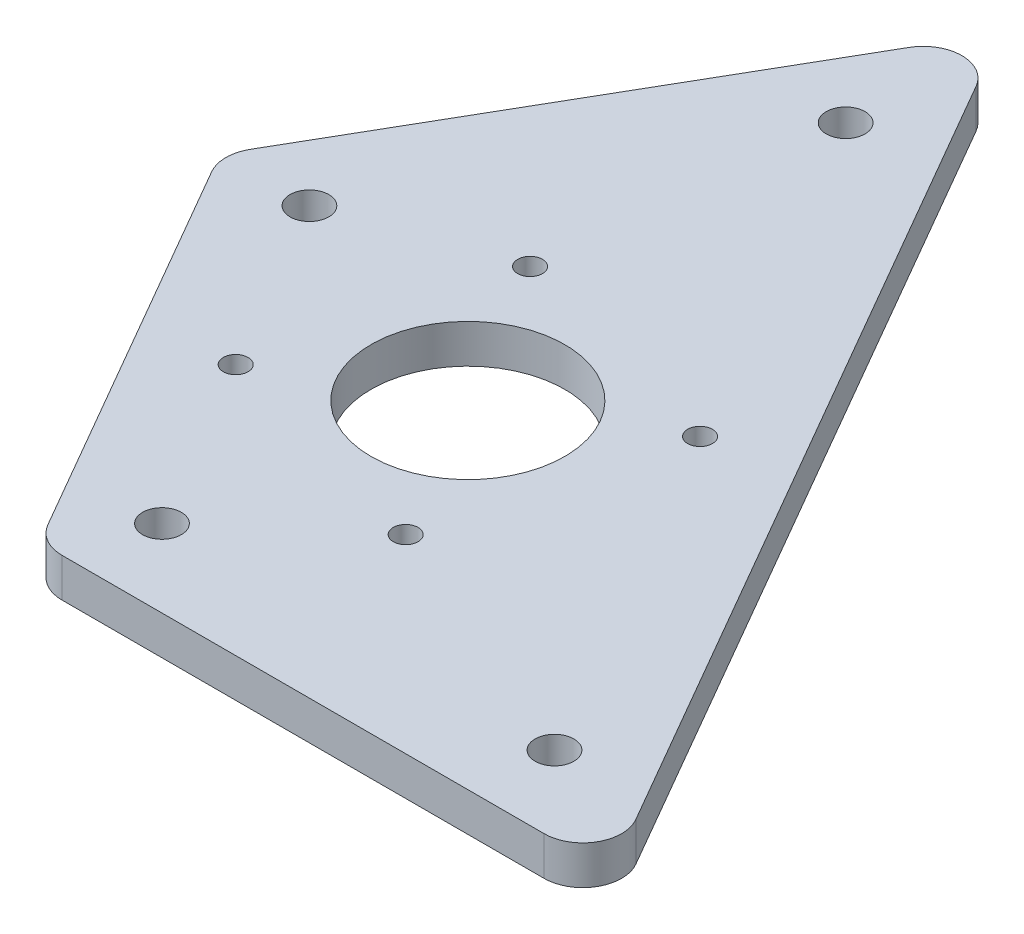
ISO-10303-21;
HEADER;
FILE_DESCRIPTION(('STEP AP214'),'2;1');
FILE_NAME('part.step','',(''),(''),'','','');
FILE_SCHEMA(('AUTOMOTIVE_DESIGN { 1 0 10303 214 1 1 1 1 }'));
ENDSEC;
DATA;
#1=APPLICATION_CONTEXT('core data for automotive mechanical design processes');
#2=APPLICATION_PROTOCOL_DEFINITION('international standard','automotive_design',2000,#1);
#3=PRODUCT_CONTEXT('',#1,'mechanical');
#4=PRODUCT('Part','Part','',(#3));
#5=PRODUCT_RELATED_PRODUCT_CATEGORY('part','',(#4));
#6=PRODUCT_DEFINITION_FORMATION('','',#4);
#7=PRODUCT_DEFINITION_CONTEXT('part definition',#1,'design');
#8=PRODUCT_DEFINITION('design','',#6,#7);
#9=PRODUCT_DEFINITION_SHAPE('','',#8);
#10=(LENGTH_UNIT() NAMED_UNIT(*) SI_UNIT(.MILLI.,.METRE.));
#11=(NAMED_UNIT(*) PLANE_ANGLE_UNIT() SI_UNIT($,.RADIAN.));
#12=(NAMED_UNIT(*) SI_UNIT($,.STERADIAN.) SOLID_ANGLE_UNIT());
#13=UNCERTAINTY_MEASURE_WITH_UNIT(LENGTH_MEASURE(1.E-05),#10,'distance_accuracy_value','');
#14=(GEOMETRIC_REPRESENTATION_CONTEXT(3) GLOBAL_UNCERTAINTY_ASSIGNED_CONTEXT((#13)) GLOBAL_UNIT_ASSIGNED_CONTEXT((#10,
#11,#12)) REPRESENTATION_CONTEXT('',''));
#15=CARTESIAN_POINT('',(0.,0.,0.));
#16=DIRECTION('',(0.,0.,1.));
#17=DIRECTION('',(1.,0.,0.));
#18=AXIS2_PLACEMENT_3D('',#15,#16,#17);
#19=CARTESIAN_POINT('',(0.,5.,0.));
#20=DIRECTION('',(0.,-1.,0.));
#21=DIRECTION('',(0.,0.,-1.));
#22=AXIS2_PLACEMENT_3D('',#19,#20,#21);
#23=PLANE('',#22);
#24=DIRECTION('',(-0.499999999999998,0.,0.86602540378444));
#25=VECTOR('',#24,1.);
#26=CARTESIAN_POINT('',(14.4337567297405,5.,-45.0000000000003));
#27=LINE('',#26,#25);
#28=CARTESIAN_POINT('',(46.9620291033702,5.,-101.340620433566));
#29=VERTEX_POINT('',#28);
#30=CARTESIAN_POINT('',(15.8771324027145,5.,-47.5000000000003));
#31=VERTEX_POINT('',#30);
#32=EDGE_CURVE('E139',#29,#31,#27,.T.);
#33=ORIENTED_EDGE('',*,*,#32,.T.);
#34=CARTESIAN_POINT('',(20.2072594216367,5.,-45.0000000000003));
#35=DIRECTION('',(0.,-1.,0.));
#36=DIRECTION('',(0.,0.,-1.));
#37=AXIS2_PLACEMENT_3D('',#34,#35,#36);
#38=CIRCLE('',#37,5.);
#39=CARTESIAN_POINT('',(15.8771324027146,5.,-42.5000000000003));
#40=VERTEX_POINT('',#39);
#41=EDGE_CURVE('E153',#31,#40,#38,.F.);
#42=ORIENTED_EDGE('',*,*,#41,.T.);
#43=DIRECTION('',(0.5,0.,0.866025403784439));
#44=VECTOR('',#43,1.);
#45=CARTESIAN_POINT('',(46.1880215351701,5.,10.));
#46=LINE('',#45,#44);
#47=CARTESIAN_POINT('',(44.744645862196,5.,7.50000000000001));
#48=VERTEX_POINT('',#47);
#49=EDGE_CURVE('E120',#40,#48,#46,.T.);
#50=ORIENTED_EDGE('',*,*,#49,.T.);
#51=CARTESIAN_POINT('',(49.0747728811182,5.,5.00000000000001));
#52=DIRECTION('',(0.,-1.,0.));
#53=DIRECTION('',(0.,0.,-1.));
#54=AXIS2_PLACEMENT_3D('',#51,#52,#53);
#55=CIRCLE('',#54,5.);
#56=CARTESIAN_POINT('',(49.0747728811182,5.,10.));
#57=VERTEX_POINT('',#56);
#58=EDGE_CURVE('E149',#48,#57,#55,.F.);
#59=ORIENTED_EDGE('',*,*,#58,.T.);
#60=DIRECTION('',(1.,0.,0.));
#61=VECTOR('',#60,1.);
#62=CARTESIAN_POINT('',(119.904820320274,5.,10.));
#63=LINE('',#62,#61);
#64=CARTESIAN_POINT('',(111.24456628243,5.,10.));
#65=VERTEX_POINT('',#64);
#66=EDGE_CURVE('E162',#57,#65,#63,.T.);
#67=ORIENTED_EDGE('',*,*,#66,.T.);
#68=CARTESIAN_POINT('',(111.24456628243,5.,5.00000000000002));
#69=DIRECTION('',(0.,-1.,0.));
#70=DIRECTION('',(0.,0.,-1.));
#71=AXIS2_PLACEMENT_3D('',#68,#69,#70);
#72=CIRCLE('',#71,5.);
#73=CARTESIAN_POINT('',(115.574693301352,5.,2.50000000000002));
#74=VERTEX_POINT('',#73);
#75=EDGE_CURVE('E55',#65,#74,#72,.F.);
#76=ORIENTED_EDGE('',*,*,#75,.T.);
#77=DIRECTION('',(-0.5,0.,-0.866025403784438));
#78=VECTOR('',#77,1.);
#79=CARTESIAN_POINT('',(51.2921561222924,5.,-108.840620433566));
#80=LINE('',#79,#78);
#81=CARTESIAN_POINT('',(55.6222831412146,5.,-101.340620433566));
#82=VERTEX_POINT('',#81);
#83=EDGE_CURVE('E140',#74,#82,#80,.T.);
#84=ORIENTED_EDGE('',*,*,#83,.T.);
#85=CARTESIAN_POINT('',(51.2921561222924,5.,-98.8406204335663));
#86=DIRECTION('',(0.,-1.,0.));
#87=DIRECTION('',(0.,0.,-1.));
#88=AXIS2_PLACEMENT_3D('',#85,#86,#87);
#89=CIRCLE('',#88,5.);
#90=EDGE_CURVE('E151',#82,#29,#89,.F.);
#91=ORIENTED_EDGE('',*,*,#90,.T.);
#92=EDGE_LOOP('',(#33,#42,#50,#59,#67,#76,#84,#91));
#93=FACE_BOUND('',#92,.T.);
#94=CARTESIAN_POINT('',(102.584312244585,5.,0.));
#95=DIRECTION('',(0.,1.,0.));
#96=DIRECTION('',(0.,0.,1.));
#97=AXIS2_PLACEMENT_3D('',#94,#95,#96);
#98=CIRCLE('',#97,2.5);
#99=CARTESIAN_POINT('',(102.584312244585,5.,2.50000000000005));
#100=VERTEX_POINT('',#99);
#101=EDGE_CURVE('E134',#100,#100,#98,.T.);
#102=ORIENTED_EDGE('',*,*,#101,.F.);
#103=EDGE_LOOP('',(#102));
#104=FACE_BOUND('',#103,.T.);
#105=CARTESIAN_POINT('',(51.2921561222924,5.,-88.8406204335663));
#106=DIRECTION('',(0.,1.,0.));
#107=DIRECTION('',(0.,0.,1.));
#108=AXIS2_PLACEMENT_3D('',#105,#106,#107);
#109=CIRCLE('',#108,2.50000000000002);
#110=CARTESIAN_POINT('',(51.2921561222924,5.,-86.3406204335663));
#111=VERTEX_POINT('',#110);
#112=EDGE_CURVE('E185',#111,#111,#109,.T.);
#113=ORIENTED_EDGE('',*,*,#112,.F.);
#114=EDGE_LOOP('',(#113));
#115=FACE_BOUND('',#114,.T.);
#116=CARTESIAN_POINT('',(25.980762113533,5.,-45.0000000000003));
#117=DIRECTION('',(0.,1.,0.));
#118=DIRECTION('',(0.,0.,1.));
#119=AXIS2_PLACEMENT_3D('',#116,#117,#118);
#120=CIRCLE('',#119,2.49999999999996);
#121=CARTESIAN_POINT('',(25.980762113533,5.,-42.5000000000003));
#122=VERTEX_POINT('',#121);
#123=EDGE_CURVE('E191',#122,#122,#120,.T.);
#124=ORIENTED_EDGE('',*,*,#123,.F.);
#125=EDGE_LOOP('',(#124));
#126=FACE_BOUND('',#125,.T.);
#127=CARTESIAN_POINT('',(51.9615242270664,5.,0.));
#128=DIRECTION('',(0.,1.,0.));
#129=DIRECTION('',(0.,0.,1.));
#130=AXIS2_PLACEMENT_3D('',#127,#128,#129);
#131=CIRCLE('',#130,2.5);
#132=CARTESIAN_POINT('',(51.9615242270664,5.,2.50000000000001));
#133=VERTEX_POINT('',#132);
#134=EDGE_CURVE('E197',#133,#133,#131,.T.);
#135=ORIENTED_EDGE('',*,*,#134,.F.);
#136=EDGE_LOOP('',(#135));
#137=FACE_BOUND('',#136,.T.);
#138=CARTESIAN_POINT('',(46.9945335684778,5.,-52.4437006149612));
#139=DIRECTION('',(0.,1.,0.));
#140=DIRECTION('',(0.,0.,1.));
#141=AXIS2_PLACEMENT_3D('',#138,#139,#140);
#142=CIRCLE('',#141,1.60000000000002);
#143=CARTESIAN_POINT('',(46.9945335684778,5.,-50.8437006149612));
#144=VERTEX_POINT('',#143);
#145=EDGE_CURVE('E203',#144,#144,#142,.T.);
#146=ORIENTED_EDGE('',*,*,#145,.F.);
#147=EDGE_LOOP('',(#146));
#148=FACE_BOUND('',#147,.T.);
#149=CARTESIAN_POINT('',(76.9382341834389,5.,-44.420310216783));
#150=DIRECTION('',(0.,1.,0.));
#151=DIRECTION('',(0.,0.,1.));
#152=AXIS2_PLACEMENT_3D('',#149,#150,#151);
#153=CIRCLE('',#152,1.60000000000001);
#154=CARTESIAN_POINT('',(76.9382341834389,5.,-42.820310216783));
#155=VERTEX_POINT('',#154);
#156=EDGE_CURVE('E209',#155,#155,#153,.T.);
#157=ORIENTED_EDGE('',*,*,#156,.F.);
#158=EDGE_LOOP('',(#157));
#159=FACE_BOUND('',#158,.T.);
#160=CARTESIAN_POINT('',(68.9148437852608,5.,-14.476609601822));
#161=DIRECTION('',(0.,1.,0.));
#162=DIRECTION('',(0.,0.,1.));
#163=AXIS2_PLACEMENT_3D('',#160,#161,#162);
#164=CIRCLE('',#163,1.6);
#165=CARTESIAN_POINT('',(68.9148437852608,5.,-12.876609601822));
#166=VERTEX_POINT('',#165);
#167=EDGE_CURVE('E215',#166,#166,#164,.T.);
#168=ORIENTED_EDGE('',*,*,#167,.F.);
#169=EDGE_LOOP('',(#168));
#170=FACE_BOUND('',#169,.T.);
#171=CARTESIAN_POINT('',(38.9711431702997,5.,-22.5000000000001));
#172=DIRECTION('',(0.,1.,0.));
#173=DIRECTION('',(0.,0.,1.));
#174=AXIS2_PLACEMENT_3D('',#171,#172,#173);
#175=CIRCLE('',#174,1.6);
#176=CARTESIAN_POINT('',(38.9711431702997,5.,-20.9000000000001));
#177=VERTEX_POINT('',#176);
#178=EDGE_CURVE('E221',#177,#177,#175,.T.);
#179=ORIENTED_EDGE('',*,*,#178,.F.);
#180=EDGE_LOOP('',(#179));
#181=FACE_BOUND('',#180,.T.);
#182=CARTESIAN_POINT('',(57.9546886768693,5.,-33.4601551083916));
#183=DIRECTION('',(0.,1.,0.));
#184=DIRECTION('',(0.,0.,1.));
#185=AXIS2_PLACEMENT_3D('',#182,#183,#184);
#186=CIRCLE('',#185,12.5);
#187=CARTESIAN_POINT('',(57.9546886768693,5.,-20.9601551083916));
#188=VERTEX_POINT('',#187);
#189=EDGE_CURVE('E227',#188,#188,#186,.T.);
#190=ORIENTED_EDGE('',*,*,#189,.F.);
#191=EDGE_LOOP('',(#190));
#192=FACE_BOUND('',#191,.T.);
#193=ADVANCED_FACE('F33',(#93,#104,#115,#126,#137,#148,#159,#170,#181,#192),#23,.F.);
#194=CARTESIAN_POINT('',(0.,0.,0.));
#195=DIRECTION('',(0.,-1.,0.));
#196=DIRECTION('',(0.,0.,-1.));
#197=AXIS2_PLACEMENT_3D('',#194,#195,#196);
#198=PLANE('',#197);
#199=CARTESIAN_POINT('',(38.9711431702997,0.,-22.5000000000001));
#200=DIRECTION('',(0.,1.,0.));
#201=DIRECTION('',(0.,0.,1.));
#202=AXIS2_PLACEMENT_3D('',#199,#200,#201);
#203=CIRCLE('',#202,1.6);
#204=CARTESIAN_POINT('',(38.9711431702997,0.,-20.9000000000001));
#205=VERTEX_POINT('',#204);
#206=EDGE_CURVE('E224',#205,#205,#203,.T.);
#207=ORIENTED_EDGE('',*,*,#206,.T.);
#208=EDGE_LOOP('',(#207));
#209=FACE_BOUND('',#208,.T.);
#210=CARTESIAN_POINT('',(76.9382341834389,0.,-44.420310216783));
#211=DIRECTION('',(0.,1.,0.));
#212=DIRECTION('',(0.,0.,1.));
#213=AXIS2_PLACEMENT_3D('',#210,#211,#212);
#214=CIRCLE('',#213,1.60000000000001);
#215=CARTESIAN_POINT('',(76.9382341834389,0.,-42.820310216783));
#216=VERTEX_POINT('',#215);
#217=EDGE_CURVE('E212',#216,#216,#214,.T.);
#218=ORIENTED_EDGE('',*,*,#217,.T.);
#219=EDGE_LOOP('',(#218));
#220=FACE_BOUND('',#219,.T.);
#221=CARTESIAN_POINT('',(51.9615242270664,0.,0.));
#222=DIRECTION('',(0.,1.,0.));
#223=DIRECTION('',(0.,0.,1.));
#224=AXIS2_PLACEMENT_3D('',#221,#222,#223);
#225=CIRCLE('',#224,2.5);
#226=CARTESIAN_POINT('',(51.9615242270664,0.,2.50000000000001));
#227=VERTEX_POINT('',#226);
#228=EDGE_CURVE('E200',#227,#227,#225,.T.);
#229=ORIENTED_EDGE('',*,*,#228,.T.);
#230=EDGE_LOOP('',(#229));
#231=FACE_BOUND('',#230,.T.);
#232=CARTESIAN_POINT('',(51.2921561222924,0.,-88.8406204335663));
#233=DIRECTION('',(0.,1.,0.));
#234=DIRECTION('',(0.,0.,1.));
#235=AXIS2_PLACEMENT_3D('',#232,#233,#234);
#236=CIRCLE('',#235,2.50000000000002);
#237=CARTESIAN_POINT('',(51.2921561222924,0.,-86.3406204335663));
#238=VERTEX_POINT('',#237);
#239=EDGE_CURVE('E188',#238,#238,#236,.T.);
#240=ORIENTED_EDGE('',*,*,#239,.T.);
#241=EDGE_LOOP('',(#240));
#242=FACE_BOUND('',#241,.T.);
#243=DIRECTION('',(0.5,0.,0.866025403784439));
#244=VECTOR('',#243,1.);
#245=CARTESIAN_POINT('',(46.1880215351701,0.,10.));
#246=LINE('',#245,#244);
#247=CARTESIAN_POINT('',(15.8771324027146,0.,-42.5000000000003));
#248=VERTEX_POINT('',#247);
#249=CARTESIAN_POINT('',(44.744645862196,0.,7.50000000000001));
#250=VERTEX_POINT('',#249);
#251=EDGE_CURVE('E117',#248,#250,#246,.T.);
#252=ORIENTED_EDGE('',*,*,#251,.F.);
#253=CARTESIAN_POINT('',(20.2072594216367,0.,-45.0000000000003));
#254=DIRECTION('',(0.,-1.,0.));
#255=DIRECTION('',(0.,0.,-1.));
#256=AXIS2_PLACEMENT_3D('',#253,#254,#255);
#257=CIRCLE('',#256,5.);
#258=CARTESIAN_POINT('',(15.8771324027145,0.,-47.5000000000003));
#259=VERTEX_POINT('',#258);
#260=EDGE_CURVE('E100',#248,#259,#257,.T.);
#261=ORIENTED_EDGE('',*,*,#260,.T.);
#262=DIRECTION('',(-0.499999999999998,0.,0.86602540378444));
#263=VECTOR('',#262,1.);
#264=CARTESIAN_POINT('',(14.4337567297405,0.,-45.0000000000003));
#265=LINE('',#264,#263);
#266=CARTESIAN_POINT('',(46.9620291033702,0.,-101.340620433566));
#267=VERTEX_POINT('',#266);
#268=EDGE_CURVE('E129',#267,#259,#265,.T.);
#269=ORIENTED_EDGE('',*,*,#268,.F.);
#270=CARTESIAN_POINT('',(51.2921561222924,0.,-98.8406204335663));
#271=DIRECTION('',(0.,-1.,0.));
#272=DIRECTION('',(0.,0.,-1.));
#273=AXIS2_PLACEMENT_3D('',#270,#271,#272);
#274=CIRCLE('',#273,5.);
#275=CARTESIAN_POINT('',(55.6222831412146,0.,-101.340620433566));
#276=VERTEX_POINT('',#275);
#277=EDGE_CURVE('E111',#267,#276,#274,.T.);
#278=ORIENTED_EDGE('',*,*,#277,.T.);
#279=DIRECTION('',(-0.5,0.,-0.866025403784438));
#280=VECTOR('',#279,1.);
#281=CARTESIAN_POINT('',(51.2921561222924,0.,-108.840620433566));
#282=LINE('',#281,#280);
#283=CARTESIAN_POINT('',(115.574693301352,0.,2.50000000000002));
#284=VERTEX_POINT('',#283);
#285=EDGE_CURVE('E132',#284,#276,#282,.T.);
#286=ORIENTED_EDGE('',*,*,#285,.F.);
#287=CARTESIAN_POINT('',(111.24456628243,0.,5.00000000000002));
#288=DIRECTION('',(0.,-1.,0.));
#289=DIRECTION('',(0.,0.,-1.));
#290=AXIS2_PLACEMENT_3D('',#287,#288,#289);
#291=CIRCLE('',#290,5.);
#292=CARTESIAN_POINT('',(111.24456628243,0.,10.));
#293=VERTEX_POINT('',#292);
#294=EDGE_CURVE('E121',#284,#293,#291,.T.);
#295=ORIENTED_EDGE('',*,*,#294,.T.);
#296=DIRECTION('',(1.,0.,0.));
#297=VECTOR('',#296,1.);
#298=CARTESIAN_POINT('',(119.904820320274,0.,10.));
#299=LINE('',#298,#297);
#300=CARTESIAN_POINT('',(49.0747728811182,0.,10.));
#301=VERTEX_POINT('',#300);
#302=EDGE_CURVE('E128',#301,#293,#299,.T.);
#303=ORIENTED_EDGE('',*,*,#302,.F.);
#304=CARTESIAN_POINT('',(49.0747728811182,0.,5.00000000000001));
#305=DIRECTION('',(0.,-1.,0.));
#306=DIRECTION('',(0.,0.,-1.));
#307=AXIS2_PLACEMENT_3D('',#304,#305,#306);
#308=CIRCLE('',#307,5.);
#309=EDGE_CURVE('E127',#301,#250,#308,.T.);
#310=ORIENTED_EDGE('',*,*,#309,.T.);
#311=EDGE_LOOP('',(#252,#261,#269,#278,#286,#295,#303,#310));
#312=FACE_BOUND('',#311,.T.);
#313=CARTESIAN_POINT('',(102.584312244585,0.,0.));
#314=DIRECTION('',(0.,1.,0.));
#315=DIRECTION('',(0.,0.,1.));
#316=AXIS2_PLACEMENT_3D('',#313,#314,#315);
#317=CIRCLE('',#316,2.5);
#318=CARTESIAN_POINT('',(102.584312244585,0.,2.50000000000005));
#319=VERTEX_POINT('',#318);
#320=EDGE_CURVE('E182',#319,#319,#317,.T.);
#321=ORIENTED_EDGE('',*,*,#320,.T.);
#322=EDGE_LOOP('',(#321));
#323=FACE_BOUND('',#322,.T.);
#324=CARTESIAN_POINT('',(25.980762113533,0.,-45.0000000000003));
#325=DIRECTION('',(0.,1.,0.));
#326=DIRECTION('',(0.,0.,1.));
#327=AXIS2_PLACEMENT_3D('',#324,#325,#326);
#328=CIRCLE('',#327,2.49999999999996);
#329=CARTESIAN_POINT('',(25.980762113533,0.,-42.5000000000003));
#330=VERTEX_POINT('',#329);
#331=EDGE_CURVE('E194',#330,#330,#328,.T.);
#332=ORIENTED_EDGE('',*,*,#331,.T.);
#333=EDGE_LOOP('',(#332));
#334=FACE_BOUND('',#333,.T.);
#335=CARTESIAN_POINT('',(46.9945335684778,0.,-52.4437006149612));
#336=DIRECTION('',(0.,1.,0.));
#337=DIRECTION('',(0.,0.,1.));
#338=AXIS2_PLACEMENT_3D('',#335,#336,#337);
#339=CIRCLE('',#338,1.60000000000002);
#340=CARTESIAN_POINT('',(46.9945335684778,0.,-50.8437006149612));
#341=VERTEX_POINT('',#340);
#342=EDGE_CURVE('E206',#341,#341,#339,.T.);
#343=ORIENTED_EDGE('',*,*,#342,.T.);
#344=EDGE_LOOP('',(#343));
#345=FACE_BOUND('',#344,.T.);
#346=CARTESIAN_POINT('',(68.9148437852608,0.,-14.476609601822));
#347=DIRECTION('',(0.,1.,0.));
#348=DIRECTION('',(0.,0.,1.));
#349=AXIS2_PLACEMENT_3D('',#346,#347,#348);
#350=CIRCLE('',#349,1.6);
#351=CARTESIAN_POINT('',(68.9148437852608,0.,-12.876609601822));
#352=VERTEX_POINT('',#351);
#353=EDGE_CURVE('E218',#352,#352,#350,.T.);
#354=ORIENTED_EDGE('',*,*,#353,.T.);
#355=EDGE_LOOP('',(#354));
#356=FACE_BOUND('',#355,.T.);
#357=CARTESIAN_POINT('',(57.9546886768693,0.,-33.4601551083916));
#358=DIRECTION('',(0.,1.,0.));
#359=DIRECTION('',(0.,0.,1.));
#360=AXIS2_PLACEMENT_3D('',#357,#358,#359);
#361=CIRCLE('',#360,12.5);
#362=CARTESIAN_POINT('',(57.9546886768693,0.,-20.9601551083916));
#363=VERTEX_POINT('',#362);
#364=EDGE_CURVE('E230',#363,#363,#361,.T.);
#365=ORIENTED_EDGE('',*,*,#364,.T.);
#366=EDGE_LOOP('',(#365));
#367=FACE_BOUND('',#366,.T.);
#368=ADVANCED_FACE('F124',(#209,#220,#231,#242,#312,#323,#334,#345,#356,#367),#198,.T.);
#369=CARTESIAN_POINT('',(14.4337567297405,5.,-45.0000000000003));
#370=DIRECTION('',(0.86602540378444,0.,0.499999999999998));
#371=DIRECTION('',(0.499999999999998,0.,-0.86602540378444));
#372=AXIS2_PLACEMENT_3D('',#369,#370,#371);
#373=PLANE('',#372);
#374=ORIENTED_EDGE('',*,*,#268,.T.);
#375=DIRECTION('',(0.,-1.,0.));
#376=VECTOR('',#375,1.);
#377=CARTESIAN_POINT('',(15.8771324027145,5.,-47.5000000000003));
#378=LINE('',#377,#376);
#379=EDGE_CURVE('E105',#259,#31,#378,.F.);
#380=ORIENTED_EDGE('',*,*,#379,.T.);
#381=ORIENTED_EDGE('',*,*,#32,.F.);
#382=DIRECTION('',(0.,-1.,0.));
#383=VECTOR('',#382,1.);
#384=CARTESIAN_POINT('',(46.9620291033702,5.,-101.340620433566));
#385=LINE('',#384,#383);
#386=EDGE_CURVE('E110',#29,#267,#385,.T.);
#387=ORIENTED_EDGE('',*,*,#386,.T.);
#388=EDGE_LOOP('',(#374,#380,#381,#387));
#389=FACE_BOUND('',#388,.T.);
#390=ADVANCED_FACE('F178',(#389),#373,.F.);
#391=CARTESIAN_POINT('',(46.1880215351701,5.,10.));
#392=DIRECTION('',(0.866025403784439,0.,-0.5));
#393=DIRECTION('',(-0.5,0.,-0.866025403784439));
#394=AXIS2_PLACEMENT_3D('',#391,#392,#393);
#395=PLANE('',#394);
#396=ORIENTED_EDGE('',*,*,#49,.F.);
#397=DIRECTION('',(0.,-1.,0.));
#398=VECTOR('',#397,1.);
#399=CARTESIAN_POINT('',(15.8771324027146,5.,-42.5000000000003));
#400=LINE('',#399,#398);
#401=EDGE_CURVE('E104',#40,#248,#400,.T.);
#402=ORIENTED_EDGE('',*,*,#401,.T.);
#403=ORIENTED_EDGE('',*,*,#251,.T.);
#404=DIRECTION('',(0.,-1.,0.));
#405=VECTOR('',#404,1.);
#406=CARTESIAN_POINT('',(44.744645862196,5.,7.50000000000001));
#407=LINE('',#406,#405);
#408=EDGE_CURVE('E122',#250,#48,#407,.F.);
#409=ORIENTED_EDGE('',*,*,#408,.T.);
#410=EDGE_LOOP('',(#396,#402,#403,#409));
#411=FACE_BOUND('',#410,.T.);
#412=ADVANCED_FACE('F116',(#411),#395,.F.);
#413=CARTESIAN_POINT('',(119.904820320274,5.,10.));
#414=DIRECTION('',(0.,0.,-1.));
#415=DIRECTION('',(-1.,0.,0.));
#416=AXIS2_PLACEMENT_3D('',#413,#414,#415);
#417=PLANE('',#416);
#418=ORIENTED_EDGE('',*,*,#66,.F.);
#419=DIRECTION('',(0.,-1.,0.));
#420=VECTOR('',#419,1.);
#421=CARTESIAN_POINT('',(49.0747728811182,5.,10.));
#422=LINE('',#421,#420);
#423=EDGE_CURVE('E11',#57,#301,#422,.T.);
#424=ORIENTED_EDGE('',*,*,#423,.T.);
#425=ORIENTED_EDGE('',*,*,#302,.T.);
#426=DIRECTION('',(0.,-1.,0.));
#427=VECTOR('',#426,1.);
#428=CARTESIAN_POINT('',(111.24456628243,5.,10.));
#429=LINE('',#428,#427);
#430=EDGE_CURVE('E41',#293,#65,#429,.F.);
#431=ORIENTED_EDGE('',*,*,#430,.T.);
#432=EDGE_LOOP('',(#418,#424,#425,#431));
#433=FACE_BOUND('',#432,.T.);
#434=ADVANCED_FACE('F161',(#433),#417,.F.);
#435=CARTESIAN_POINT('',(51.2921561222924,5.,-108.840620433566));
#436=DIRECTION('',(-0.866025403784438,0.,0.5));
#437=DIRECTION('',(0.5,0.,0.866025403784439));
#438=AXIS2_PLACEMENT_3D('',#435,#436,#437);
#439=PLANE('',#438);
#440=ORIENTED_EDGE('',*,*,#285,.T.);
#441=DIRECTION('',(0.,-1.,0.));
#442=VECTOR('',#441,1.);
#443=CARTESIAN_POINT('',(55.6222831412146,5.,-101.340620433566));
#444=LINE('',#443,#442);
#445=EDGE_CURVE('E48',#276,#82,#444,.F.);
#446=ORIENTED_EDGE('',*,*,#445,.T.);
#447=ORIENTED_EDGE('',*,*,#83,.F.);
#448=DIRECTION('',(0.,-1.,0.));
#449=VECTOR('',#448,1.);
#450=CARTESIAN_POINT('',(115.574693301352,5.,2.50000000000002));
#451=LINE('',#450,#449);
#452=EDGE_CURVE('E155',#74,#284,#451,.T.);
#453=ORIENTED_EDGE('',*,*,#452,.T.);
#454=EDGE_LOOP('',(#440,#446,#447,#453));
#455=FACE_BOUND('',#454,.T.);
#456=ADVANCED_FACE('F171',(#455),#439,.F.);
#457=CARTESIAN_POINT('',(102.584312244585,5.,0.));
#458=DIRECTION('',(0.,-1.,0.));
#459=DIRECTION('',(0.,0.,-1.));
#460=AXIS2_PLACEMENT_3D('',#457,#458,#459);
#461=CYLINDRICAL_SURFACE('',#460,2.5);
#462=ORIENTED_EDGE('',*,*,#101,.T.);
#463=EDGE_LOOP('',(#462));
#464=FACE_BOUND('',#463,.T.);
#465=ORIENTED_EDGE('',*,*,#320,.F.);
#466=EDGE_LOOP('',(#465));
#467=FACE_BOUND('',#466,.T.);
#468=ADVANCED_FACE('F247',(#464,#467),#461,.F.);
#469=CARTESIAN_POINT('',(51.2921561222924,5.,-88.8406204335663));
#470=DIRECTION('',(0.,-1.,0.));
#471=DIRECTION('',(0.,0.,-1.));
#472=AXIS2_PLACEMENT_3D('',#469,#470,#471);
#473=CYLINDRICAL_SURFACE('',#472,2.50000000000002);
#474=ORIENTED_EDGE('',*,*,#112,.T.);
#475=EDGE_LOOP('',(#474));
#476=FACE_BOUND('',#475,.T.);
#477=ORIENTED_EDGE('',*,*,#239,.F.);
#478=EDGE_LOOP('',(#477));
#479=FACE_BOUND('',#478,.T.);
#480=ADVANCED_FACE('F389',(#476,#479),#473,.F.);
#481=CARTESIAN_POINT('',(25.980762113533,5.,-45.0000000000003));
#482=DIRECTION('',(0.,-1.,0.));
#483=DIRECTION('',(0.,0.,-1.));
#484=AXIS2_PLACEMENT_3D('',#481,#482,#483);
#485=CYLINDRICAL_SURFACE('',#484,2.49999999999996);
#486=ORIENTED_EDGE('',*,*,#123,.T.);
#487=EDGE_LOOP('',(#486));
#488=FACE_BOUND('',#487,.T.);
#489=ORIENTED_EDGE('',*,*,#331,.F.);
#490=EDGE_LOOP('',(#489));
#491=FACE_BOUND('',#490,.T.);
#492=ADVANCED_FACE('F379',(#488,#491),#485,.F.);
#493=CARTESIAN_POINT('',(51.9615242270664,5.,0.));
#494=DIRECTION('',(0.,-1.,0.));
#495=DIRECTION('',(0.,0.,-1.));
#496=AXIS2_PLACEMENT_3D('',#493,#494,#495);
#497=CYLINDRICAL_SURFACE('',#496,2.5);
#498=ORIENTED_EDGE('',*,*,#134,.T.);
#499=EDGE_LOOP('',(#498));
#500=FACE_BOUND('',#499,.T.);
#501=ORIENTED_EDGE('',*,*,#228,.F.);
#502=EDGE_LOOP('',(#501));
#503=FACE_BOUND('',#502,.T.);
#504=ADVANCED_FACE('F369',(#500,#503),#497,.F.);
#505=CARTESIAN_POINT('',(46.9945335684778,5.,-52.4437006149612));
#506=DIRECTION('',(0.,-1.,0.));
#507=DIRECTION('',(0.,0.,-1.));
#508=AXIS2_PLACEMENT_3D('',#505,#506,#507);
#509=CYLINDRICAL_SURFACE('',#508,1.60000000000002);
#510=ORIENTED_EDGE('',*,*,#145,.T.);
#511=EDGE_LOOP('',(#510));
#512=FACE_BOUND('',#511,.T.);
#513=ORIENTED_EDGE('',*,*,#342,.F.);
#514=EDGE_LOOP('',(#513));
#515=FACE_BOUND('',#514,.T.);
#516=ADVANCED_FACE('F359',(#512,#515),#509,.F.);
#517=CARTESIAN_POINT('',(76.9382341834389,5.,-44.420310216783));
#518=DIRECTION('',(0.,-1.,0.));
#519=DIRECTION('',(0.,0.,-1.));
#520=AXIS2_PLACEMENT_3D('',#517,#518,#519);
#521=CYLINDRICAL_SURFACE('',#520,1.60000000000001);
#522=ORIENTED_EDGE('',*,*,#156,.T.);
#523=EDGE_LOOP('',(#522));
#524=FACE_BOUND('',#523,.T.);
#525=ORIENTED_EDGE('',*,*,#217,.F.);
#526=EDGE_LOOP('',(#525));
#527=FACE_BOUND('',#526,.T.);
#528=ADVANCED_FACE('F349',(#524,#527),#521,.F.);
#529=CARTESIAN_POINT('',(68.9148437852608,5.,-14.476609601822));
#530=DIRECTION('',(0.,-1.,0.));
#531=DIRECTION('',(0.,0.,-1.));
#532=AXIS2_PLACEMENT_3D('',#529,#530,#531);
#533=CYLINDRICAL_SURFACE('',#532,1.6);
#534=ORIENTED_EDGE('',*,*,#167,.T.);
#535=EDGE_LOOP('',(#534));
#536=FACE_BOUND('',#535,.T.);
#537=ORIENTED_EDGE('',*,*,#353,.F.);
#538=EDGE_LOOP('',(#537));
#539=FACE_BOUND('',#538,.T.);
#540=ADVANCED_FACE('F339',(#536,#539),#533,.F.);
#541=CARTESIAN_POINT('',(38.9711431702997,5.,-22.5000000000001));
#542=DIRECTION('',(0.,-1.,0.));
#543=DIRECTION('',(0.,0.,-1.));
#544=AXIS2_PLACEMENT_3D('',#541,#542,#543);
#545=CYLINDRICAL_SURFACE('',#544,1.6);
#546=ORIENTED_EDGE('',*,*,#178,.T.);
#547=EDGE_LOOP('',(#546));
#548=FACE_BOUND('',#547,.T.);
#549=ORIENTED_EDGE('',*,*,#206,.F.);
#550=EDGE_LOOP('',(#549));
#551=FACE_BOUND('',#550,.T.);
#552=ADVANCED_FACE('F330',(#548,#551),#545,.F.);
#553=CARTESIAN_POINT('',(57.9546886768693,5.,-33.4601551083916));
#554=DIRECTION('',(0.,-1.,0.));
#555=DIRECTION('',(0.,0.,-1.));
#556=AXIS2_PLACEMENT_3D('',#553,#554,#555);
#557=CYLINDRICAL_SURFACE('',#556,12.5);
#558=ORIENTED_EDGE('',*,*,#189,.T.);
#559=EDGE_LOOP('',(#558));
#560=FACE_BOUND('',#559,.T.);
#561=ORIENTED_EDGE('',*,*,#364,.F.);
#562=EDGE_LOOP('',(#561));
#563=FACE_BOUND('',#562,.T.);
#564=ADVANCED_FACE('F236',(#560,#563),#557,.F.);
#565=CARTESIAN_POINT('',(20.2072594216367,5.,-45.0000000000003));
#566=DIRECTION('',(0.,-1.,0.));
#567=DIRECTION('',(0.,0.,-1.));
#568=AXIS2_PLACEMENT_3D('',#565,#566,#567);
#569=CYLINDRICAL_SURFACE('',#568,5.);
#570=ORIENTED_EDGE('',*,*,#41,.F.);
#571=ORIENTED_EDGE('',*,*,#379,.F.);
#572=ORIENTED_EDGE('',*,*,#260,.F.);
#573=ORIENTED_EDGE('',*,*,#401,.F.);
#574=EDGE_LOOP('',(#570,#571,#572,#573));
#575=FACE_BOUND('',#574,.T.);
#576=ADVANCED_FACE('F103',(#575),#569,.T.);
#577=CARTESIAN_POINT('',(51.2921561222924,5.,-98.8406204335663));
#578=DIRECTION('',(0.,-1.,0.));
#579=DIRECTION('',(0.,0.,-1.));
#580=AXIS2_PLACEMENT_3D('',#577,#578,#579);
#581=CYLINDRICAL_SURFACE('',#580,5.);
#582=ORIENTED_EDGE('',*,*,#90,.F.);
#583=ORIENTED_EDGE('',*,*,#445,.F.);
#584=ORIENTED_EDGE('',*,*,#277,.F.);
#585=ORIENTED_EDGE('',*,*,#386,.F.);
#586=EDGE_LOOP('',(#582,#583,#584,#585));
#587=FACE_BOUND('',#586,.T.);
#588=ADVANCED_FACE('F175',(#587),#581,.T.);
#589=CARTESIAN_POINT('',(49.0747728811182,5.,5.00000000000001));
#590=DIRECTION('',(0.,-1.,0.));
#591=DIRECTION('',(0.,0.,-1.));
#592=AXIS2_PLACEMENT_3D('',#589,#590,#591);
#593=CYLINDRICAL_SURFACE('',#592,5.);
#594=ORIENTED_EDGE('',*,*,#58,.F.);
#595=ORIENTED_EDGE('',*,*,#408,.F.);
#596=ORIENTED_EDGE('',*,*,#309,.F.);
#597=ORIENTED_EDGE('',*,*,#423,.F.);
#598=EDGE_LOOP('',(#594,#595,#596,#597));
#599=FACE_BOUND('',#598,.T.);
#600=ADVANCED_FACE('F261',(#599),#593,.T.);
#601=CARTESIAN_POINT('',(111.24456628243,5.,5.00000000000002));
#602=DIRECTION('',(0.,-1.,0.));
#603=DIRECTION('',(0.,0.,-1.));
#604=AXIS2_PLACEMENT_3D('',#601,#602,#603);
#605=CYLINDRICAL_SURFACE('',#604,5.);
#606=ORIENTED_EDGE('',*,*,#75,.F.);
#607=ORIENTED_EDGE('',*,*,#430,.F.);
#608=ORIENTED_EDGE('',*,*,#294,.F.);
#609=ORIENTED_EDGE('',*,*,#452,.F.);
#610=EDGE_LOOP('',(#606,#607,#608,#609));
#611=FACE_BOUND('',#610,.T.);
#612=ADVANCED_FACE('F35',(#611),#605,.T.);
#613=CLOSED_SHELL('',(#193,#368,#390,#412,#434,#456,#468,#480,#492,#504,#516,#528,#540,#552,
#564,#576,#588,#600,#612));
#614=MANIFOLD_SOLID_BREP('B2',#613);
#615=ADVANCED_BREP_SHAPE_REPRESENTATION('',(#18,#614),#14);
#616=SHAPE_DEFINITION_REPRESENTATION(#9,#615);
ENDSEC;
END-ISO-10303-21;
